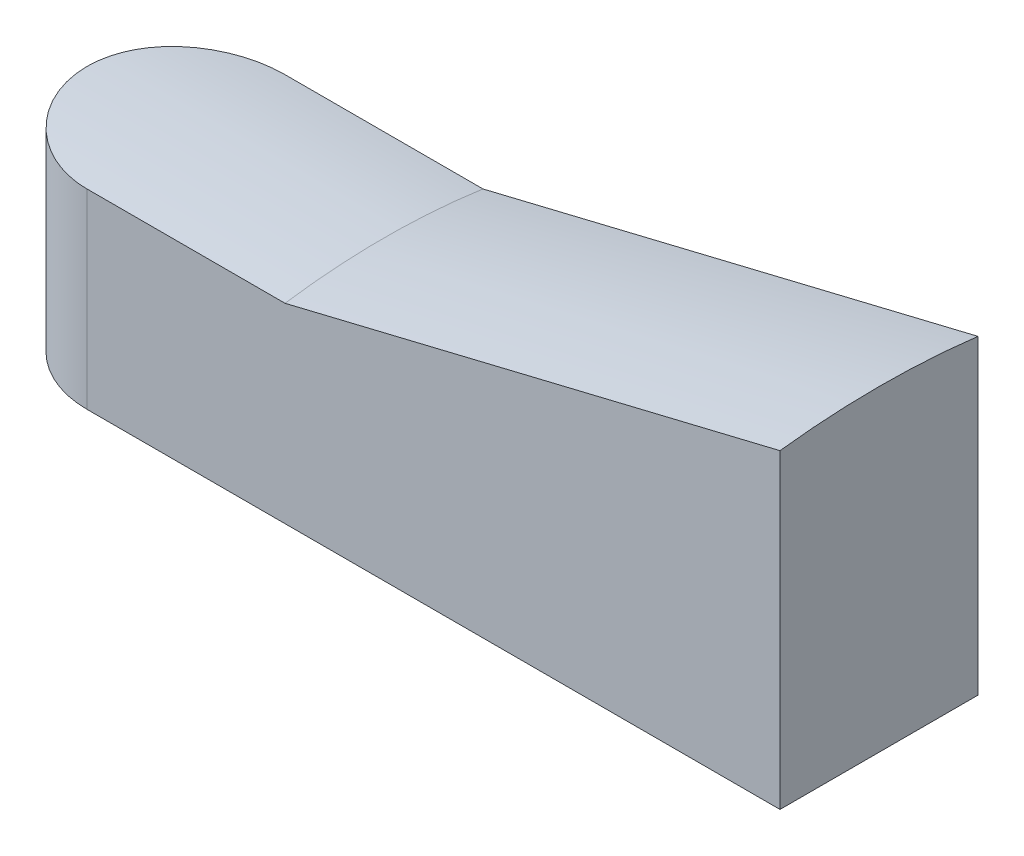
ISO-10303-21;
HEADER;
FILE_DESCRIPTION(('STEP AP214'),'2;1');
FILE_NAME('part.step','',(''),(''),'','','');
FILE_SCHEMA(('AUTOMOTIVE_DESIGN { 1 0 10303 214 1 1 1 1 }'));
ENDSEC;
DATA;
#1=APPLICATION_CONTEXT('core data for automotive mechanical design processes');
#2=APPLICATION_PROTOCOL_DEFINITION('international standard','automotive_design',2000,#1);
#3=PRODUCT_CONTEXT('',#1,'mechanical');
#4=PRODUCT('Part','Part','',(#3));
#5=PRODUCT_RELATED_PRODUCT_CATEGORY('part','',(#4));
#6=PRODUCT_DEFINITION_FORMATION('','',#4);
#7=PRODUCT_DEFINITION_CONTEXT('part definition',#1,'design');
#8=PRODUCT_DEFINITION('design','',#6,#7);
#9=PRODUCT_DEFINITION_SHAPE('','',#8);
#10=(LENGTH_UNIT() NAMED_UNIT(*) SI_UNIT(.MILLI.,.METRE.));
#11=(NAMED_UNIT(*) PLANE_ANGLE_UNIT() SI_UNIT($,.RADIAN.));
#12=(NAMED_UNIT(*) SI_UNIT($,.STERADIAN.) SOLID_ANGLE_UNIT());
#13=UNCERTAINTY_MEASURE_WITH_UNIT(LENGTH_MEASURE(1.E-05),#10,'distance_accuracy_value','');
#14=(GEOMETRIC_REPRESENTATION_CONTEXT(3) GLOBAL_UNCERTAINTY_ASSIGNED_CONTEXT((#13)) GLOBAL_UNIT_ASSIGNED_CONTEXT((#10,
#11,#12)) REPRESENTATION_CONTEXT('',''));
#15=CARTESIAN_POINT('',(0.,0.,0.));
#16=DIRECTION('',(0.,0.,1.));
#17=DIRECTION('',(1.,0.,0.));
#18=AXIS2_PLACEMENT_3D('',#15,#16,#17);
#19=CARTESIAN_POINT('',(40.,0.,0.));
#20=DIRECTION('',(-1.,0.,0.));
#21=DIRECTION('',(0.,0.,1.));
#22=AXIS2_PLACEMENT_3D('',#19,#20,#21);
#23=PLANE('',#22);
#24=CARTESIAN_POINT('',(40.,0.,0.));
#25=DIRECTION('',(-1.,0.,0.));
#26=DIRECTION('',(0.,0.,1.));
#27=AXIS2_PLACEMENT_3D('',#24,#25,#26);
#28=CIRCLE('',#27,41.);
#29=CARTESIAN_POINT('',(40.,40.6939798987515,5.));
#30=VERTEX_POINT('',#29);
#31=CARTESIAN_POINT('',(40.,40.6939798987516,-5.));
#32=VERTEX_POINT('',#31);
#33=EDGE_CURVE('E163',#30,#32,#28,.T.);
#34=ORIENTED_EDGE('',*,*,#33,.F.);
#35=DIRECTION('',(0.,1.,0.));
#36=VECTOR('',#35,1.);
#37=CARTESIAN_POINT('',(40.,25.,5.));
#38=LINE('',#37,#36);
#39=CARTESIAN_POINT('',(40.,25.,5.));
#40=VERTEX_POINT('',#39);
#41=EDGE_CURVE('E96',#40,#30,#38,.T.);
#42=ORIENTED_EDGE('',*,*,#41,.F.);
#43=DIRECTION('',(0.,0.,1.));
#44=VECTOR('',#43,1.);
#45=CARTESIAN_POINT('',(40.,25.,5.));
#46=LINE('',#45,#44);
#47=CARTESIAN_POINT('',(40.,25.,-5.));
#48=VERTEX_POINT('',#47);
#49=EDGE_CURVE('E88',#48,#40,#46,.T.);
#50=ORIENTED_EDGE('',*,*,#49,.F.);
#51=DIRECTION('',(0.,-1.,0.));
#52=VECTOR('',#51,1.);
#53=CARTESIAN_POINT('',(40.,55.,-5.));
#54=LINE('',#53,#52);
#55=EDGE_CURVE('E99',#32,#48,#54,.T.);
#56=ORIENTED_EDGE('',*,*,#55,.F.);
#57=EDGE_LOOP('',(#34,#42,#50,#56));
#58=FACE_BOUND('',#57,.T.);
#59=ADVANCED_FACE('F32',(#58),#23,.F.);
#60=CARTESIAN_POINT('',(40.,0.,0.));
#61=DIRECTION('',(1.,0.,0.));
#62=DIRECTION('',(0.,0.,-1.));
#63=AXIS2_PLACEMENT_3D('',#60,#61,#62);
#64=CONICAL_SURFACE('',#63,41.,0.235544980720864);
#65=CARTESIAN_POINT('',(15.,0.,0.));
#66=DIRECTION('',(-1.,0.,0.));
#67=DIRECTION('',(0.,0.,1.));
#68=AXIS2_PLACEMENT_3D('',#65,#66,#67);
#69=CIRCLE('',#68,35.);
#70=CARTESIAN_POINT('',(15.,34.6410161513775,5.));
#71=VERTEX_POINT('',#70);
#72=CARTESIAN_POINT('',(15.,34.6410161513776,-5.));
#73=VERTEX_POINT('',#72);
#74=EDGE_CURVE('E160',#71,#73,#69,.T.);
#75=ORIENTED_EDGE('',*,*,#74,.F.);
#76=CARTESIAN_POINT('',(-37.4965367545684,21.835687246014,5.));
#77=CARTESIAN_POINT('',(-34.557254997871,22.5593239562958,5.));
#78=CARTESIAN_POINT('',(-31.6175809681835,23.2813646016743,5.));
#79=CARTESIAN_POINT('',(-25.7376039681546,24.7228774843741,5.));
#80=CARTESIAN_POINT('',(-22.7973009979783,25.4423497223686,5.));
#81=CARTESIAN_POINT('',(-16.9162223908964,26.8793493508426,5.));
#82=CARTESIAN_POINT('',(-13.9754467543476,27.5968767427832,5.));
#83=CARTESIAN_POINT('',(-8.09351800351797,29.0303833408136,5.));
#84=CARTESIAN_POINT('',(-5.15236488921229,29.7463625468019,5.00000000000001));
#85=CARTESIAN_POINT('',(1.23897720318062,31.3008107142072,5.00000000000001));
#86=CARTESIAN_POINT('',(4.68922286067224,32.1390466009579,5.));
#87=CARTESIAN_POINT('',(11.5900418939408,33.8141715898497,5.));
#88=CARTESIAN_POINT('',(15.0406152697933,34.651060691679,5.00000000000001));
#89=CARTESIAN_POINT('',(23.1585395717395,36.6186071161513,5.00000000000001));
#90=CARTESIAN_POINT('',(27.8259989900064,37.7488167833362,5.));
#91=CARTESIAN_POINT('',(37.1612811495591,40.007734937607,5.));
#92=CARTESIAN_POINT('',(41.8291038908546,41.1364434246533,5.));
#93=CARTESIAN_POINT('',(51.1650281748906,43.3926915068756,5.));
#94=CARTESIAN_POINT('',(55.8331297174218,44.5202311029177,5.));
#95=CARTESIAN_POINT('',(65.1695595567548,46.7743697901733,5.));
#96=CARTESIAN_POINT('',(69.8378878535416,47.9009688814486,5.));
#97=CARTESIAN_POINT('',(74.5063020801711,49.02721156881,4.99999999999999));
#98=B_SPLINE_CURVE_WITH_KNOTS('',3,(#76,#77,#78,#79,#80,#81,#82,#83,#84,#85,#86,#87,#88,#89,#90,
#91,#92,#93,#94,#95,#96,#97),.UNSPECIFIED.,.F.,.F.,(4,2,2,2,2,2,2,2,2,2,4),(0.,9.08114645452043,
18.1622905288328,27.2434277794637,36.3245656260299,46.9763965969494,57.6282300336224,
72.0352752437809,86.4423208349198,100.849355744672,115.256389708476),.UNSPECIFIED.);
#99=EDGE_CURVE('E162',#71,#30,#98,.T.);
#100=ORIENTED_EDGE('',*,*,#99,.T.);
#101=ORIENTED_EDGE('',*,*,#33,.T.);
#102=CARTESIAN_POINT('',(74.5063020801712,49.02721156881,-5.00000000000001));
#103=CARTESIAN_POINT('',(69.8378834748209,47.9009678979834,-5.));
#104=CARTESIAN_POINT('',(65.1695508254383,46.7743677194985,-5.));
#105=CARTESIAN_POINT('',(55.8331127350749,44.520226965398,-5.));
#106=CARTESIAN_POINT('',(51.1650072940871,43.392686389812,-5.));
#107=CARTESIAN_POINT('',(41.8290834150279,41.1364385469116,-5.));
#108=CARTESIAN_POINT('',(37.1612649766667,40.0077312807961,-5.));
#109=CARTESIAN_POINT('',(27.8259912066978,37.7488146433058,-5.));
#110=CARTESIAN_POINT('',(23.1585358751134,36.6186052718344,-4.99999999999999));
#111=CARTESIAN_POINT('',(13.8240978420366,34.356213545104,-4.99999999999999));
#112=CARTESIAN_POINT('',(9.15711514107662,33.2240311876481,-5.));
#113=CARTESIAN_POINT('',(-0.176205090254576,30.9570125956218,-5.));
#114=CARTESIAN_POINT('',(-4.84254262073232,29.8221763614903,-5.));
#115=CARTESIAN_POINT('',(-11.8413709335784,28.1171275254913,-5.));
#116=CARTESIAN_POINT('',(-14.1742020243323,27.5483118440763,-5.));
#117=CARTESIAN_POINT('',(-18.8395887917983,26.409552529526,-5.));
#118=CARTESIAN_POINT('',(-21.1721444685244,25.8396088964485,-5.));
#119=CARTESIAN_POINT('',(-25.8369237856485,24.6983585194408,-5.));
#120=CARTESIAN_POINT('',(-28.1691474258634,24.1270517747626,-5.));
#121=CARTESIAN_POINT('',(-32.8331768369684,22.9827335229174,-5.));
#122=CARTESIAN_POINT('',(-35.1649826077844,22.4097220154486,-5.));
#123=CARTESIAN_POINT('',(-37.4965367545684,21.835687246014,-5.));
#124=B_SPLINE_CURVE_WITH_KNOTS('',3,(#102,#103,#104,#105,#106,#107,#108,#109,#110,#111,#112,
#113,#114,#115,#116,#117,#118,#119,#120,#121,#122,#123),.UNSPECIFIED.,.F.,.F.,(4,2,2,2,2,2,2,2,
2,2,4),(0.,14.4070474234098,28.814094392599,43.2211265706152,57.6281596748538,72.0352088315059,
86.4422556060898,93.64578712777,100.8493182801,108.052853385833,115.256389767259),.UNSPECIFIED.);
#125=EDGE_CURVE('E102',#32,#73,#124,.T.);
#126=ORIENTED_EDGE('',*,*,#125,.T.);
#127=EDGE_LOOP('',(#75,#100,#101,#126));
#128=FACE_BOUND('',#127,.T.);
#129=ADVANCED_FACE('F122',(#128),#64,.T.);
#130=CARTESIAN_POINT('',(0.,0.,0.));
#131=DIRECTION('',(-1.,0.,0.));
#132=DIRECTION('',(0.,0.,1.));
#133=AXIS2_PLACEMENT_3D('',#130,#131,#132);
#134=CYLINDRICAL_SURFACE('',#133,35.);
#135=DIRECTION('',(-1.,0.,0.));
#136=VECTOR('',#135,1.);
#137=CARTESIAN_POINT('',(0.,34.6410161513775,-5.));
#138=LINE('',#137,#136);
#139=CARTESIAN_POINT('',(5.,34.6410161513776,-5.));
#140=VERTEX_POINT('',#139);
#141=EDGE_CURVE('E110',#73,#140,#138,.T.);
#142=ORIENTED_EDGE('',*,*,#141,.T.);
#143=CARTESIAN_POINT('',(5.,34.6410161513776,-5.));
#144=CARTESIAN_POINT('',(4.8601331524566,34.6410074254653,-5.00001591400448));
#145=CARTESIAN_POINT('',(4.72026955236822,34.6418629460144,-4.99413186280085));
#146=CARTESIAN_POINT('',(4.44155726708517,34.6452392758598,-4.9706795115777));
#147=CARTESIAN_POINT('',(4.30270849550136,34.647759941698,-4.95311221810869));
#148=CARTESIAN_POINT('',(4.02717216834054,34.6543994667685,-4.90643652423589));
#149=CARTESIAN_POINT('',(3.89048226039675,34.6585164405898,-4.87734173815598));
#150=CARTESIAN_POINT('',(3.62006611644355,34.6682270960263,-4.80783407934852));
#151=CARTESIAN_POINT('',(3.48633986836715,34.6738207716277,-4.76742125271318));
#152=CARTESIAN_POINT('',(3.22277664710956,34.6863256678612,-4.67557011081946));
#153=CARTESIAN_POINT('',(3.09294010723693,34.6932370346555,-4.62413057236637));
#154=CARTESIAN_POINT('',(2.83802945248598,34.7081823220313,-4.51058295782813));
#155=CARTESIAN_POINT('',(2.71295711211455,34.7162166557775,-4.4484709531652));
#156=CARTESIAN_POINT('',(2.4685369564341,34.7331749859888,-4.31406296068154));
#157=CARTESIAN_POINT('',(2.34918695020605,34.7420986378649,-4.24177091292848));
#158=CARTESIAN_POINT('',(2.11693734794553,34.7605903768907,-4.08746793098907));
#159=CARTESIAN_POINT('',(2.00404002691665,34.7701586887672,-4.00545359999446));
#160=CARTESIAN_POINT('',(1.78483421572632,34.7897297720872,-3.83176003564178));
#161=CARTESIAN_POINT('',(1.67857088900145,34.7997348683032,-3.74002406184521));
#162=CARTESIAN_POINT('',(1.47413536922616,34.8198416284602,-3.54795017067553));
#163=CARTESIAN_POINT('',(1.3759632044309,34.8299432927383,-3.44761222326597));
#164=CARTESIAN_POINT('',(1.18835687762864,34.8499629634002,-3.23899111179321));
#165=CARTESIAN_POINT('',(1.09892592069398,34.8598809013462,-3.13070505875026));
#166=CARTESIAN_POINT('',(0.929498379196468,34.8792474208841,-2.90700815567611));
#167=CARTESIAN_POINT('',(0.849498523875499,34.8886961645333,-2.79159979697965));
#168=CARTESIAN_POINT('',(0.699091386612825,34.9069077968776,-2.55383451398512));
#169=CARTESIAN_POINT('',(0.628733573931444,34.9156670571345,-2.43144600764249));
#170=CARTESIAN_POINT('',(0.498616113723303,34.9321956414936,-2.18115374047272));
#171=CARTESIAN_POINT('',(0.438852572728313,34.9399653289738,-2.05325202735982));
#172=CARTESIAN_POINT('',(0.330349407120462,34.9542950387279,-1.79283272437053));
#173=CARTESIAN_POINT('',(0.281606139478571,34.960855460622,-1.66031667664502));
#174=CARTESIAN_POINT('',(0.195495613427302,34.9725813991628,-1.39163498907485));
#175=CARTESIAN_POINT('',(0.158125597559441,34.9777472538895,-1.25547024258645));
#176=CARTESIAN_POINT('',(0.0845566538024927,34.9879952305847,-0.934716754454136));
#177=CARTESIAN_POINT('',(0.0528565922499688,34.9924813701557,-0.749045323123254));
#178=CARTESIAN_POINT('',(0.0211502433336899,34.9969835026089,-0.4689311641501));
#179=CARTESIAN_POINT('',(0.0132220913650755,34.998113027132,-0.375328275023659));
#180=CARTESIAN_POINT('',(0.00264758662724899,34.9996216382506,-0.187825091495892));
#181=CARTESIAN_POINT('',(8.67321408169972E-07,35.0000007769237,-0.0939248181863719));
#182=CARTESIAN_POINT('',(0.,35.,0.));
#183=B_SPLINE_CURVE_WITH_KNOTS('',3,(#143,#144,#145,#146,#147,#148,#149,#150,#151,#152,#153,
#154,#155,#156,#157,#158,#159,#160,#161,#162,#163,#164,#165,#166,#167,#168,#169,#170,#171,#172,
#173,#174,#175,#176,#177,#178,#179,#180,#181,#182),.UNSPECIFIED.,.F.,.F.,(4,2,2,2,2,2,2,2,2,2,2,
2,2,2,2,2,2,2,2,4),(0.,0.419469433101491,0.838902732184769,1.25784213721246,1.67677983615248,
2.09576403198191,2.51490278928829,2.93387976740151,3.35300356312916,3.77472450518056,
4.19644691986147,4.61832338875549,5.04005311544612,5.4638714530736,5.88753371015461,
6.31105570955481,6.7344749435878,7.29832251378617,7.58002954808518,7.86171703095848),.UNSPECIFIED.);
#184=CARTESIAN_POINT('',(0.,35.,0.));
#185=VERTEX_POINT('',#184);
#186=EDGE_CURVE('E42',#140,#185,#183,.T.);
#187=ORIENTED_EDGE('',*,*,#186,.T.);
#188=CARTESIAN_POINT('',(0.,35.,0.));
#189=CARTESIAN_POINT('',(-1.58975717707219E-05,35.0000083920871,0.139874224407655));
#190=CARTESIAN_POINT('',(0.00586875749002139,34.9991617982512,0.2797452441287));
#191=CARTESIAN_POINT('',(0.0293236405245906,34.9958193830043,0.558472784081785));
#192=CARTESIAN_POINT('',(0.0468928777057719,34.9933237014274,0.697329389321684));
#193=CARTESIAN_POINT('',(0.093574118144598,34.9867476831074,0.972882854564903));
#194=CARTESIAN_POINT('',(0.122672599157449,34.9826692028877,1.10958205030555));
#195=CARTESIAN_POINT('',(0.192189451908189,34.9730446244359,1.38001689533607));
#196=CARTESIAN_POINT('',(0.232607773764874,34.9674985326708,1.51375255768203));
#197=CARTESIAN_POINT('',(0.324472073206801,34.9550925307142,1.77733525397385));
#198=CARTESIAN_POINT('',(0.375919346265098,34.9482324661922,1.90718182905932));
#199=CARTESIAN_POINT('',(0.489484317029221,34.9333877943281,2.16211169292469));
#200=CARTESIAN_POINT('',(0.551605943602725,34.9254027731232,2.28719320706377));
#201=CARTESIAN_POINT('',(0.68603446882685,34.9085355773615,2.531629726072));
#202=CARTESIAN_POINT('',(0.758337387568325,34.8996537537504,2.65098694426718));
#203=CARTESIAN_POINT('',(0.912663091954157,34.881233550825,2.88324895515188));
#204=CARTESIAN_POINT('',(0.994689274528276,34.8716949425464,2.99615147227995));
#205=CARTESIAN_POINT('',(1.16839462523722,34.8521693631768,3.2153496947839));
#206=CARTESIAN_POINT('',(1.26012922333471,34.8421800274067,3.32160126719001));
#207=CARTESIAN_POINT('',(1.45219789103425,34.8220875427778,3.52601320151658));
#208=CARTESIAN_POINT('',(1.55253199153901,34.81198439351,3.6241735343583));
#209=CARTESIAN_POINT('',(1.76114317624069,34.7919446607698,3.81175682038302));
#210=CARTESIAN_POINT('',(1.86942317234931,34.7820081400167,3.90117654213913));
#211=CARTESIAN_POINT('',(2.09310567686232,34.762589478311,4.07058249245461));
#212=CARTESIAN_POINT('',(2.20850569608155,34.7531071805969,4.15057198970459));
#213=CARTESIAN_POINT('',(2.44626451788473,34.73481609494,4.30096745753489));
#214=CARTESIAN_POINT('',(2.56865554539229,34.7260109535044,4.37132294462944));
#215=CARTESIAN_POINT('',(2.81895267105828,34.7093846165121,4.50143547857347));
#216=CARTESIAN_POINT('',(2.94685672145059,34.7015630597688,4.56119641921716));
#217=CARTESIAN_POINT('',(3.20728049073965,34.687129539056,4.66969408079196));
#218=CARTESIAN_POINT('',(3.33979865160721,34.68051717141,4.71843448211652));
#219=CARTESIAN_POINT('',(3.60848503526821,34.668693151896,4.80453918888592));
#220=CARTESIAN_POINT('',(3.74465236369177,34.6634811602026,4.84190625455965));
#221=CARTESIAN_POINT('',(4.06538730548911,34.6531394518743,4.91546224962509));
#222=CARTESIAN_POINT('',(4.25103714931645,34.6486096596152,4.94715506304332));
#223=CARTESIAN_POINT('',(4.53111959395773,34.6440630416107,4.9788543402274));
#224=CARTESIAN_POINT('',(4.624712296222,34.6429221877528,4.98678076838435));
#225=CARTESIAN_POINT('',(4.81219516488043,34.6413983560082,4.99735298440991));
#226=CARTESIAN_POINT('',(4.90608531029294,34.6410153258065,4.99999913679258));
#227=CARTESIAN_POINT('',(5.,34.6410161513775,5.));
#228=B_SPLINE_CURVE_WITH_KNOTS('',3,(#188,#189,#190,#191,#192,#193,#194,#195,#196,#197,#198,
#199,#200,#201,#202,#203,#204,#205,#206,#207,#208,#209,#210,#211,#212,#213,#214,#215,#216,#217,
#218,#219,#220,#221,#222,#223,#224,#225,#226,#227),.UNSPECIFIED.,.F.,.F.,(4,2,2,2,2,2,2,2,2,2,2,
2,2,2,2,2,2,2,2,4),(0.,0.41949166770111,0.838947769232104,1.25791335487726,1.67687709436759,
2.09589007280254,2.51505760736534,2.93406174013904,3.35321269047723,3.7749010414079,
4.19659090775857,4.61843608894973,5.04013461818406,5.46396462185954,5.88763853167557,
6.31117074267842,6.73460008326993,7.29838340729955,7.58005994995565,7.86171704692062),.UNSPECIFIED.);
#229=CARTESIAN_POINT('',(5.,34.6410161513775,5.));
#230=VERTEX_POINT('',#229);
#231=EDGE_CURVE('E49',#185,#230,#228,.T.);
#232=ORIENTED_EDGE('',*,*,#231,.T.);
#233=DIRECTION('',(-1.,0.,0.));
#234=VECTOR('',#233,1.);
#235=CARTESIAN_POINT('',(0.,34.6410161513775,5.));
#236=LINE('',#235,#234);
#237=EDGE_CURVE('E120',#230,#71,#236,.F.);
#238=ORIENTED_EDGE('',*,*,#237,.T.);
#239=ORIENTED_EDGE('',*,*,#74,.T.);
#240=EDGE_LOOP('',(#142,#187,#232,#238,#239));
#241=FACE_BOUND('',#240,.T.);
#242=ADVANCED_FACE('F131',(#241),#134,.T.);
#243=CARTESIAN_POINT('',(0.,25.,5.));
#244=DIRECTION('',(0.,0.,-1.));
#245=DIRECTION('',(0.,1.,0.));
#246=AXIS2_PLACEMENT_3D('',#243,#244,#245);
#247=PLANE('',#246);
#248=ORIENTED_EDGE('',*,*,#237,.F.);
#249=DIRECTION('',(0.,1.,0.));
#250=VECTOR('',#249,1.);
#251=CARTESIAN_POINT('',(5.,25.,5.));
#252=LINE('',#251,#250);
#253=CARTESIAN_POINT('',(5.,25.,5.));
#254=VERTEX_POINT('',#253);
#255=EDGE_CURVE('E11',#230,#254,#252,.F.);
#256=ORIENTED_EDGE('',*,*,#255,.T.);
#257=DIRECTION('',(1.,0.,0.));
#258=VECTOR('',#257,1.);
#259=CARTESIAN_POINT('',(0.,25.,5.));
#260=LINE('',#259,#258);
#261=EDGE_CURVE('E95',#254,#40,#260,.T.);
#262=ORIENTED_EDGE('',*,*,#261,.T.);
#263=ORIENTED_EDGE('',*,*,#41,.T.);
#264=ORIENTED_EDGE('',*,*,#99,.F.);
#265=EDGE_LOOP('',(#248,#256,#262,#263,#264));
#266=FACE_BOUND('',#265,.T.);
#267=ADVANCED_FACE('F129',(#266),#247,.F.);
#268=CARTESIAN_POINT('',(0.,55.,-5.));
#269=DIRECTION('',(0.,0.,1.));
#270=DIRECTION('',(0.,-1.,0.));
#271=AXIS2_PLACEMENT_3D('',#268,#269,#270);
#272=PLANE('',#271);
#273=DIRECTION('',(1.,0.,0.));
#274=VECTOR('',#273,1.);
#275=CARTESIAN_POINT('',(0.,25.,-5.));
#276=LINE('',#275,#274);
#277=CARTESIAN_POINT('',(5.00000000000002,25.,-5.));
#278=VERTEX_POINT('',#277);
#279=EDGE_CURVE('E83',#278,#48,#276,.T.);
#280=ORIENTED_EDGE('',*,*,#279,.F.);
#281=DIRECTION('',(0.,-1.,0.));
#282=VECTOR('',#281,1.);
#283=CARTESIAN_POINT('',(5.,55.0000000000001,-5.));
#284=LINE('',#283,#282);
#285=EDGE_CURVE('E173',#278,#140,#284,.F.);
#286=ORIENTED_EDGE('',*,*,#285,.T.);
#287=ORIENTED_EDGE('',*,*,#141,.F.);
#288=ORIENTED_EDGE('',*,*,#125,.F.);
#289=ORIENTED_EDGE('',*,*,#55,.T.);
#290=EDGE_LOOP('',(#280,#286,#287,#288,#289));
#291=FACE_BOUND('',#290,.T.);
#292=ADVANCED_FACE('F100',(#291),#272,.F.);
#293=CARTESIAN_POINT('',(0.,25.,5.));
#294=DIRECTION('',(0.,1.,0.));
#295=DIRECTION('',(0.,0.,1.));
#296=AXIS2_PLACEMENT_3D('',#293,#294,#295);
#297=PLANE('',#296);
#298=CARTESIAN_POINT('',(5.,25.,0.));
#299=DIRECTION('',(0.,1.,0.));
#300=DIRECTION('',(0.,0.,1.));
#301=AXIS2_PLACEMENT_3D('',#298,#299,#300);
#302=CIRCLE('',#301,5.);
#303=CARTESIAN_POINT('',(0.,25.,0.));
#304=VERTEX_POINT('',#303);
#305=EDGE_CURVE('E165',#254,#304,#302,.F.);
#306=ORIENTED_EDGE('',*,*,#305,.T.);
#307=CARTESIAN_POINT('',(5.,25.,0.));
#308=DIRECTION('',(0.,1.,0.));
#309=DIRECTION('',(0.,0.,1.));
#310=AXIS2_PLACEMENT_3D('',#307,#308,#309);
#311=CIRCLE('',#310,5.);
#312=EDGE_CURVE('E91',#304,#278,#311,.F.);
#313=ORIENTED_EDGE('',*,*,#312,.T.);
#314=ORIENTED_EDGE('',*,*,#279,.T.);
#315=ORIENTED_EDGE('',*,*,#49,.T.);
#316=ORIENTED_EDGE('',*,*,#261,.F.);
#317=EDGE_LOOP('',(#306,#313,#314,#315,#316));
#318=FACE_BOUND('',#317,.T.);
#319=ADVANCED_FACE('F85',(#318),#297,.F.);
#320=CARTESIAN_POINT('',(5.,22.4975663390288,0.));
#321=DIRECTION('',(0.,1.,0.));
#322=DIRECTION('',(0.,0.,1.));
#323=AXIS2_PLACEMENT_3D('',#320,#321,#322);
#324=CYLINDRICAL_SURFACE('',#323,5.);
#325=ORIENTED_EDGE('',*,*,#255,.F.);
#326=ORIENTED_EDGE('',*,*,#231,.F.);
#327=DIRECTION('',(0.,1.,0.));
#328=VECTOR('',#327,1.);
#329=CARTESIAN_POINT('',(0.,22.4975663390288,0.));
#330=LINE('',#329,#328);
#331=EDGE_CURVE('E37',#304,#185,#330,.T.);
#332=ORIENTED_EDGE('',*,*,#331,.F.);
#333=ORIENTED_EDGE('',*,*,#305,.F.);
#334=EDGE_LOOP('',(#325,#326,#332,#333));
#335=FACE_BOUND('',#334,.T.);
#336=ADVANCED_FACE('F34',(#335),#324,.T.);
#337=CARTESIAN_POINT('',(5.,22.4975663390288,0.));
#338=DIRECTION('',(0.,-1.,0.));
#339=DIRECTION('',(0.,0.,-1.));
#340=AXIS2_PLACEMENT_3D('',#337,#338,#339);
#341=CYLINDRICAL_SURFACE('',#340,5.);
#342=ORIENTED_EDGE('',*,*,#186,.F.);
#343=ORIENTED_EDGE('',*,*,#285,.F.);
#344=ORIENTED_EDGE('',*,*,#312,.F.);
#345=ORIENTED_EDGE('',*,*,#331,.T.);
#346=EDGE_LOOP('',(#342,#343,#344,#345));
#347=FACE_BOUND('',#346,.T.);
#348=ADVANCED_FACE('F146',(#347),#341,.T.);
#349=CLOSED_SHELL('',(#59,#129,#242,#267,#292,#319,#336,#348));
#350=MANIFOLD_SOLID_BREP('B2',#349);
#351=ADVANCED_BREP_SHAPE_REPRESENTATION('',(#18,#350),#14);
#352=SHAPE_DEFINITION_REPRESENTATION(#9,#351);
ENDSEC;
END-ISO-10303-21;
